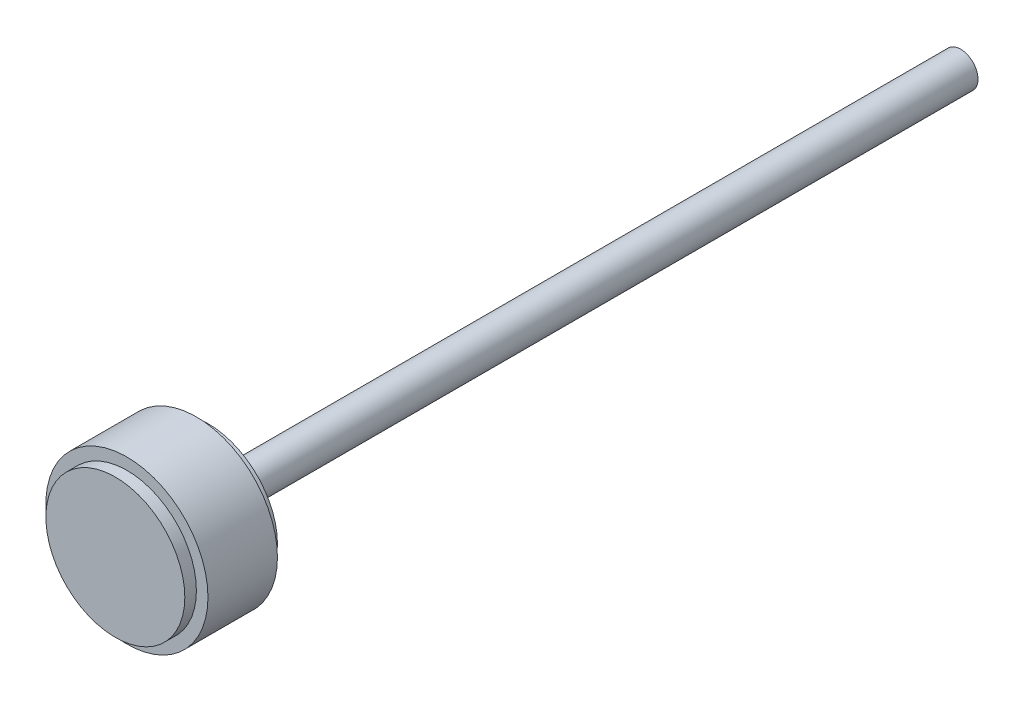
ISO-10303-21;
HEADER;
FILE_DESCRIPTION(('STEP AP214'),'2;1');
FILE_NAME('part.step','',(''),(''),'','','');
FILE_SCHEMA(('AUTOMOTIVE_DESIGN { 1 0 10303 214 1 1 1 1 }'));
ENDSEC;
DATA;
#1=APPLICATION_CONTEXT('core data for automotive mechanical design processes');
#2=APPLICATION_PROTOCOL_DEFINITION('international standard','automotive_design',2000,#1);
#3=PRODUCT_CONTEXT('',#1,'mechanical');
#4=PRODUCT('Part','Part','',(#3));
#5=PRODUCT_RELATED_PRODUCT_CATEGORY('part','',(#4));
#6=PRODUCT_DEFINITION_FORMATION('','',#4);
#7=PRODUCT_DEFINITION_CONTEXT('part definition',#1,'design');
#8=PRODUCT_DEFINITION('design','',#6,#7);
#9=PRODUCT_DEFINITION_SHAPE('','',#8);
#10=(LENGTH_UNIT() NAMED_UNIT(*) SI_UNIT(.MILLI.,.METRE.));
#11=(NAMED_UNIT(*) PLANE_ANGLE_UNIT() SI_UNIT($,.RADIAN.));
#12=(NAMED_UNIT(*) SI_UNIT($,.STERADIAN.) SOLID_ANGLE_UNIT());
#13=UNCERTAINTY_MEASURE_WITH_UNIT(LENGTH_MEASURE(1.E-05),#10,'distance_accuracy_value','');
#14=(GEOMETRIC_REPRESENTATION_CONTEXT(3) GLOBAL_UNCERTAINTY_ASSIGNED_CONTEXT((#13)) GLOBAL_UNIT_ASSIGNED_CONTEXT((#10,
#11,#12)) REPRESENTATION_CONTEXT('',''));
#15=CARTESIAN_POINT('',(0.,0.,0.));
#16=DIRECTION('',(0.,0.,1.));
#17=DIRECTION('',(1.,0.,0.));
#18=AXIS2_PLACEMENT_3D('',#15,#16,#17);
#19=CARTESIAN_POINT('',(0.,0.,-320.));
#20=DIRECTION('',(0.,0.,1.));
#21=DIRECTION('',(1.,0.,0.));
#22=AXIS2_PLACEMENT_3D('',#19,#20,#21);
#23=CYLINDRICAL_SURFACE('',#22,7.5);
#24=CARTESIAN_POINT('',(0.,0.,-320.));
#25=DIRECTION('',(0.,0.,1.));
#26=DIRECTION('',(1.,0.,0.));
#27=AXIS2_PLACEMENT_3D('',#24,#25,#26);
#28=CIRCLE('',#27,7.5);
#29=CARTESIAN_POINT('',(7.5,0.,-320.));
#30=VERTEX_POINT('',#29);
#31=EDGE_CURVE('E48',#30,#30,#28,.T.);
#32=ORIENTED_EDGE('',*,*,#31,.T.);
#33=EDGE_LOOP('',(#32));
#34=FACE_BOUND('',#33,.T.);
#35=CARTESIAN_POINT('',(0.,0.,0.));
#36=DIRECTION('',(0.,0.,1.));
#37=DIRECTION('',(1.,0.,0.));
#38=AXIS2_PLACEMENT_3D('',#35,#36,#37);
#39=CIRCLE('',#38,7.5);
#40=CARTESIAN_POINT('',(7.5,0.,0.));
#41=VERTEX_POINT('',#40);
#42=EDGE_CURVE('E44',#41,#41,#39,.T.);
#43=ORIENTED_EDGE('',*,*,#42,.F.);
#44=EDGE_LOOP('',(#43));
#45=FACE_BOUND('',#44,.T.);
#46=ADVANCED_FACE('F41',(#34,#45),#23,.T.);
#47=CARTESIAN_POINT('',(0.,0.,-320.));
#48=DIRECTION('',(0.,0.,1.));
#49=DIRECTION('',(1.,0.,0.));
#50=AXIS2_PLACEMENT_3D('',#47,#48,#49);
#51=PLANE('',#50);
#52=ORIENTED_EDGE('',*,*,#31,.F.);
#53=EDGE_LOOP('',(#52));
#54=FACE_BOUND('',#53,.T.);
#55=ADVANCED_FACE('F89',(#54),#51,.F.);
#56=CARTESIAN_POINT('',(0.,0.,5.));
#57=DIRECTION('',(0.,0.,-1.));
#58=DIRECTION('',(-1.,0.,0.));
#59=AXIS2_PLACEMENT_3D('',#56,#57,#58);
#60=CYLINDRICAL_SURFACE('',#59,10.);
#61=CARTESIAN_POINT('',(0.,0.,5.));
#62=DIRECTION('',(0.,0.,1.));
#63=DIRECTION('',(1.,0.,0.));
#64=AXIS2_PLACEMENT_3D('',#61,#62,#63);
#65=CIRCLE('',#64,10.);
#66=CARTESIAN_POINT('',(10.,0.,5.));
#67=VERTEX_POINT('',#66);
#68=EDGE_CURVE('E69',#67,#67,#65,.T.);
#69=ORIENTED_EDGE('',*,*,#68,.F.);
#70=EDGE_LOOP('',(#69));
#71=FACE_BOUND('',#70,.T.);
#72=CARTESIAN_POINT('',(0.,0.,0.));
#73=DIRECTION('',(0.,0.,1.));
#74=DIRECTION('',(1.,0.,0.));
#75=AXIS2_PLACEMENT_3D('',#72,#73,#74);
#76=CIRCLE('',#75,10.);
#77=CARTESIAN_POINT('',(10.,0.,0.));
#78=VERTEX_POINT('',#77);
#79=EDGE_CURVE('E66',#78,#78,#76,.T.);
#80=ORIENTED_EDGE('',*,*,#79,.T.);
#81=EDGE_LOOP('',(#80));
#82=FACE_BOUND('',#81,.T.);
#83=ADVANCED_FACE('F75',(#71,#82),#60,.T.);
#84=CARTESIAN_POINT('',(0.,0.,0.));
#85=DIRECTION('',(0.,0.,1.));
#86=DIRECTION('',(1.,0.,0.));
#87=AXIS2_PLACEMENT_3D('',#84,#85,#86);
#88=PLANE('',#87);
#89=ORIENTED_EDGE('',*,*,#42,.T.);
#90=EDGE_LOOP('',(#89));
#91=FACE_BOUND('',#90,.T.);
#92=ORIENTED_EDGE('',*,*,#79,.F.);
#93=EDGE_LOOP('',(#92));
#94=FACE_BOUND('',#93,.T.);
#95=ADVANCED_FACE('F77',(#91,#94),#88,.F.);
#96=CARTESIAN_POINT('',(0.,0.,10.));
#97=DIRECTION('',(0.,0.,-1.));
#98=DIRECTION('',(-1.,0.,0.));
#99=AXIS2_PLACEMENT_3D('',#96,#97,#98);
#100=CYLINDRICAL_SURFACE('',#99,30.);
#101=CARTESIAN_POINT('',(0.,0.,10.));
#102=DIRECTION('',(0.,0.,1.));
#103=DIRECTION('',(1.,0.,0.));
#104=AXIS2_PLACEMENT_3D('',#101,#102,#103);
#105=CIRCLE('',#104,30.);
#106=CARTESIAN_POINT('',(30.,0.,10.));
#107=VERTEX_POINT('',#106);
#108=EDGE_CURVE('E63',#107,#107,#105,.T.);
#109=ORIENTED_EDGE('',*,*,#108,.F.);
#110=EDGE_LOOP('',(#109));
#111=FACE_BOUND('',#110,.T.);
#112=CARTESIAN_POINT('',(0.,0.,5.));
#113=DIRECTION('',(0.,0.,1.));
#114=DIRECTION('',(1.,0.,0.));
#115=AXIS2_PLACEMENT_3D('',#112,#113,#114);
#116=CIRCLE('',#115,30.);
#117=CARTESIAN_POINT('',(30.,0.,5.));
#118=VERTEX_POINT('',#117);
#119=EDGE_CURVE('E59',#118,#118,#116,.T.);
#120=ORIENTED_EDGE('',*,*,#119,.T.);
#121=EDGE_LOOP('',(#120));
#122=FACE_BOUND('',#121,.T.);
#123=ADVANCED_FACE('F79',(#111,#122),#100,.T.);
#124=CARTESIAN_POINT('',(0.,0.,5.));
#125=DIRECTION('',(0.,0.,1.));
#126=DIRECTION('',(1.,0.,0.));
#127=AXIS2_PLACEMENT_3D('',#124,#125,#126);
#128=PLANE('',#127);
#129=ORIENTED_EDGE('',*,*,#68,.T.);
#130=EDGE_LOOP('',(#129));
#131=FACE_BOUND('',#130,.T.);
#132=ORIENTED_EDGE('',*,*,#119,.F.);
#133=EDGE_LOOP('',(#132));
#134=FACE_BOUND('',#133,.T.);
#135=ADVANCED_FACE('F86',(#131,#134),#128,.F.);
#136=CARTESIAN_POINT('',(0.,0.,40.));
#137=DIRECTION('',(0.,0.,-1.));
#138=DIRECTION('',(-1.,0.,0.));
#139=AXIS2_PLACEMENT_3D('',#136,#137,#138);
#140=CYLINDRICAL_SURFACE('',#139,35.);
#141=CARTESIAN_POINT('',(0.,0.,40.));
#142=DIRECTION('',(0.,0.,1.));
#143=DIRECTION('',(1.,0.,0.));
#144=AXIS2_PLACEMENT_3D('',#141,#142,#143);
#145=CIRCLE('',#144,35.);
#146=CARTESIAN_POINT('',(35.,0.,40.));
#147=VERTEX_POINT('',#146);
#148=EDGE_CURVE('E56',#147,#147,#145,.T.);
#149=ORIENTED_EDGE('',*,*,#148,.F.);
#150=EDGE_LOOP('',(#149));
#151=FACE_BOUND('',#150,.T.);
#152=CARTESIAN_POINT('',(0.,0.,10.));
#153=DIRECTION('',(0.,0.,1.));
#154=DIRECTION('',(1.,0.,0.));
#155=AXIS2_PLACEMENT_3D('',#152,#153,#154);
#156=CIRCLE('',#155,35.);
#157=CARTESIAN_POINT('',(35.,0.,10.));
#158=VERTEX_POINT('',#157);
#159=EDGE_CURVE('E60',#158,#158,#156,.T.);
#160=ORIENTED_EDGE('',*,*,#159,.T.);
#161=EDGE_LOOP('',(#160));
#162=FACE_BOUND('',#161,.T.);
#163=ADVANCED_FACE('F129',(#151,#162),#140,.T.);
#164=CARTESIAN_POINT('',(0.,0.,40.));
#165=DIRECTION('',(0.,0.,1.));
#166=DIRECTION('',(1.,0.,0.));
#167=AXIS2_PLACEMENT_3D('',#164,#165,#166);
#168=PLANE('',#167);
#169=CARTESIAN_POINT('',(0.,0.,40.));
#170=DIRECTION('',(0.,0.,1.));
#171=DIRECTION('',(1.,0.,0.));
#172=AXIS2_PLACEMENT_3D('',#169,#170,#171);
#173=CIRCLE('',#172,30.);
#174=CARTESIAN_POINT('',(30.,0.,40.));
#175=VERTEX_POINT('',#174);
#176=EDGE_CURVE('E10',#175,#175,#173,.T.);
#177=ORIENTED_EDGE('',*,*,#176,.F.);
#178=EDGE_LOOP('',(#177));
#179=FACE_BOUND('',#178,.T.);
#180=ORIENTED_EDGE('',*,*,#148,.T.);
#181=EDGE_LOOP('',(#180));
#182=FACE_BOUND('',#181,.T.);
#183=ADVANCED_FACE('F139',(#179,#182),#168,.T.);
#184=CARTESIAN_POINT('',(0.,0.,10.));
#185=DIRECTION('',(0.,0.,1.));
#186=DIRECTION('',(1.,0.,0.));
#187=AXIS2_PLACEMENT_3D('',#184,#185,#186);
#188=PLANE('',#187);
#189=ORIENTED_EDGE('',*,*,#108,.T.);
#190=EDGE_LOOP('',(#189));
#191=FACE_BOUND('',#190,.T.);
#192=ORIENTED_EDGE('',*,*,#159,.F.);
#193=EDGE_LOOP('',(#192));
#194=FACE_BOUND('',#193,.T.);
#195=ADVANCED_FACE('F150',(#191,#194),#188,.F.);
#196=CARTESIAN_POINT('',(0.,0.,45.));
#197=DIRECTION('',(0.,0.,-1.));
#198=DIRECTION('',(-1.,0.,0.));
#199=AXIS2_PLACEMENT_3D('',#196,#197,#198);
#200=CYLINDRICAL_SURFACE('',#199,30.);
#201=CARTESIAN_POINT('',(0.,0.,45.));
#202=DIRECTION('',(0.,0.,1.));
#203=DIRECTION('',(1.,0.,0.));
#204=AXIS2_PLACEMENT_3D('',#201,#202,#203);
#205=CIRCLE('',#204,30.);
#206=CARTESIAN_POINT('',(30.,0.,45.));
#207=VERTEX_POINT('',#206);
#208=EDGE_CURVE('E55',#207,#207,#205,.T.);
#209=ORIENTED_EDGE('',*,*,#208,.F.);
#210=EDGE_LOOP('',(#209));
#211=FACE_BOUND('',#210,.T.);
#212=ORIENTED_EDGE('',*,*,#176,.T.);
#213=EDGE_LOOP('',(#212));
#214=FACE_BOUND('',#213,.T.);
#215=ADVANCED_FACE('F160',(#211,#214),#200,.T.);
#216=CARTESIAN_POINT('',(0.,0.,45.));
#217=DIRECTION('',(0.,0.,1.));
#218=DIRECTION('',(1.,0.,0.));
#219=AXIS2_PLACEMENT_3D('',#216,#217,#218);
#220=PLANE('',#219);
#221=ORIENTED_EDGE('',*,*,#208,.T.);
#222=EDGE_LOOP('',(#221));
#223=FACE_BOUND('',#222,.T.);
#224=ADVANCED_FACE('F169',(#223),#220,.T.);
#225=CLOSED_SHELL('',(#46,#55,#83,#95,#123,#135,#163,#183,#195,#215,#224));
#226=MANIFOLD_SOLID_BREP('B2',#225);
#227=ADVANCED_BREP_SHAPE_REPRESENTATION('',(#18,#226),#14);
#228=SHAPE_DEFINITION_REPRESENTATION(#9,#227);
ENDSEC;
END-ISO-10303-21;
